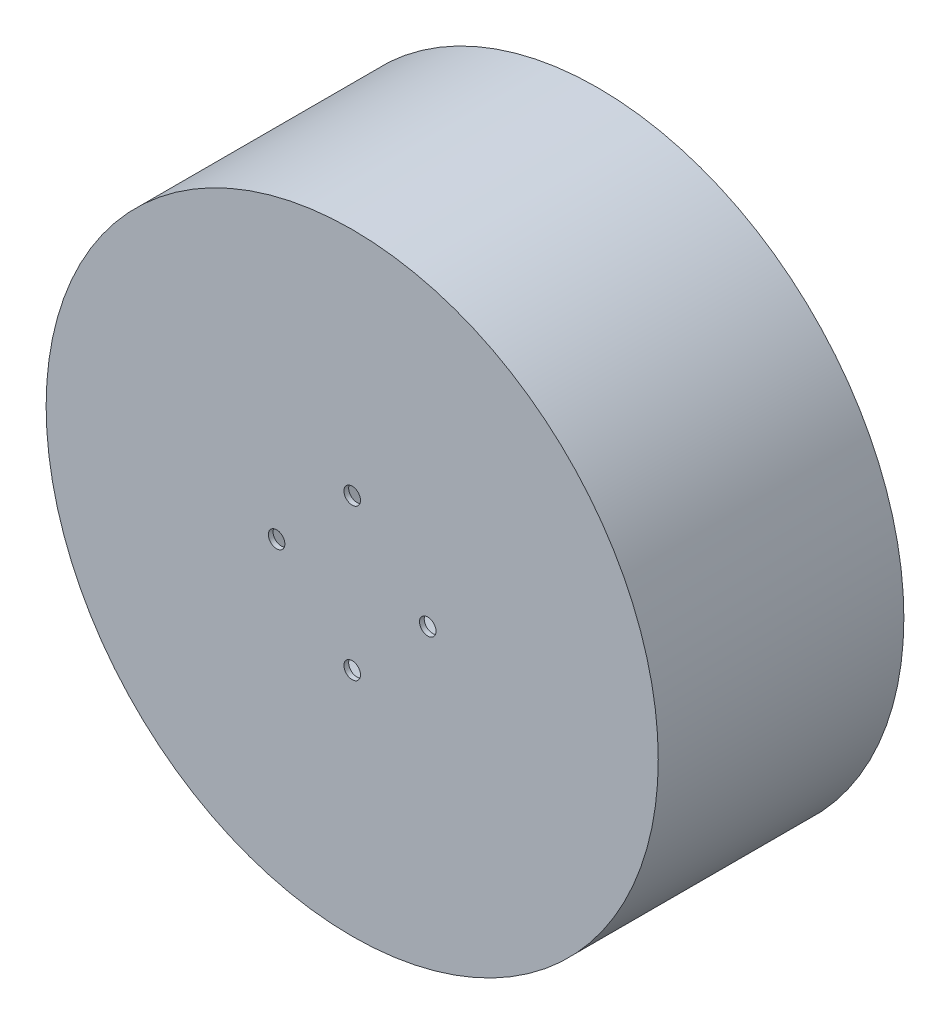
ISO-10303-21;
HEADER;
FILE_DESCRIPTION(('STEP AP214'),'2;1');
FILE_NAME('part.step','',(''),(''),'','','');
FILE_SCHEMA(('AUTOMOTIVE_DESIGN { 1 0 10303 214 1 1 1 1 }'));
ENDSEC;
DATA;
#1=APPLICATION_CONTEXT('core data for automotive mechanical design processes');
#2=APPLICATION_PROTOCOL_DEFINITION('international standard','automotive_design',2000,#1);
#3=PRODUCT_CONTEXT('',#1,'mechanical');
#4=PRODUCT('Part','Part','',(#3));
#5=PRODUCT_RELATED_PRODUCT_CATEGORY('part','',(#4));
#6=PRODUCT_DEFINITION_FORMATION('','',#4);
#7=PRODUCT_DEFINITION_CONTEXT('part definition',#1,'design');
#8=PRODUCT_DEFINITION('design','',#6,#7);
#9=PRODUCT_DEFINITION_SHAPE('','',#8);
#10=(LENGTH_UNIT() NAMED_UNIT(*) SI_UNIT(.MILLI.,.METRE.));
#11=(NAMED_UNIT(*) PLANE_ANGLE_UNIT() SI_UNIT($,.RADIAN.));
#12=(NAMED_UNIT(*) SI_UNIT($,.STERADIAN.) SOLID_ANGLE_UNIT());
#13=UNCERTAINTY_MEASURE_WITH_UNIT(LENGTH_MEASURE(1.E-05),#10,'distance_accuracy_value','');
#14=(GEOMETRIC_REPRESENTATION_CONTEXT(3) GLOBAL_UNCERTAINTY_ASSIGNED_CONTEXT((#13)) GLOBAL_UNIT_ASSIGNED_CONTEXT((#10,
#11,#12)) REPRESENTATION_CONTEXT('',''));
#15=CARTESIAN_POINT('',(0.,0.,0.));
#16=DIRECTION('',(0.,0.,1.));
#17=DIRECTION('',(1.,0.,0.));
#18=AXIS2_PLACEMENT_3D('',#15,#16,#17);
#19=CARTESIAN_POINT('',(0.,0.,3.175));
#20=DIRECTION('',(0.,0.,1.));
#21=DIRECTION('',(1.,0.,0.));
#22=AXIS2_PLACEMENT_3D('',#19,#20,#21);
#23=PLANE('',#22);
#24=CARTESIAN_POINT('',(-3.54734504026462E-13,-50.8,3.175));
#25=DIRECTION('',(0.,0.,1.));
#26=DIRECTION('',(1.,0.,0.));
#27=AXIS2_PLACEMENT_3D('',#24,#25,#26);
#28=CIRCLE('',#27,5.55625);
#29=CARTESIAN_POINT('',(5.55624999999965,-50.8,3.175));
#30=VERTEX_POINT('',#29);
#31=EDGE_CURVE('E53',#30,#30,#28,.T.);
#32=ORIENTED_EDGE('',*,*,#31,.F.);
#33=EDGE_LOOP('',(#32));
#34=FACE_BOUND('',#33,.T.);
#35=CARTESIAN_POINT('',(0.,50.8,3.175));
#36=DIRECTION('',(0.,0.,1.));
#37=DIRECTION('',(1.,0.,0.));
#38=AXIS2_PLACEMENT_3D('',#35,#36,#37);
#39=CIRCLE('',#38,5.55625);
#40=CARTESIAN_POINT('',(5.55625,50.8,3.175));
#41=VERTEX_POINT('',#40);
#42=EDGE_CURVE('E39',#41,#41,#39,.T.);
#43=ORIENTED_EDGE('',*,*,#42,.F.);
#44=EDGE_LOOP('',(#43));
#45=FACE_BOUND('',#44,.T.);
#46=CARTESIAN_POINT('',(50.8,-1.77367252013231E-13,3.175));
#47=DIRECTION('',(0.,0.,1.));
#48=DIRECTION('',(1.,0.,0.));
#49=AXIS2_PLACEMENT_3D('',#46,#47,#48);
#50=CIRCLE('',#49,5.55625);
#51=CARTESIAN_POINT('',(56.35625,-1.77367252013231E-13,3.175));
#52=VERTEX_POINT('',#51);
#53=EDGE_CURVE('E48',#52,#52,#50,.T.);
#54=ORIENTED_EDGE('',*,*,#53,.F.);
#55=EDGE_LOOP('',(#54));
#56=FACE_BOUND('',#55,.T.);
#57=CARTESIAN_POINT('',(-50.8,5.32101756039693E-13,3.175));
#58=DIRECTION('',(0.,0.,1.));
#59=DIRECTION('',(1.,0.,0.));
#60=AXIS2_PLACEMENT_3D('',#57,#58,#59);
#61=CIRCLE('',#60,5.55625);
#62=CARTESIAN_POINT('',(-45.24375,5.32101756039693E-13,3.175));
#63=VERTEX_POINT('',#62);
#64=EDGE_CURVE('E59',#63,#63,#61,.T.);
#65=ORIENTED_EDGE('',*,*,#64,.F.);
#66=EDGE_LOOP('',(#65));
#67=FACE_BOUND('',#66,.T.);
#68=CARTESIAN_POINT('',(0.,0.,3.175));
#69=DIRECTION('',(0.,0.,1.));
#70=DIRECTION('',(1.,0.,0.));
#71=AXIS2_PLACEMENT_3D('',#68,#69,#70);
#72=CIRCLE('',#71,205.74);
#73=CARTESIAN_POINT('',(205.74,0.,3.175));
#74=VERTEX_POINT('',#73);
#75=EDGE_CURVE('E68',#74,#74,#72,.T.);
#76=ORIENTED_EDGE('',*,*,#75,.T.);
#77=EDGE_LOOP('',(#76));
#78=FACE_BOUND('',#77,.T.);
#79=ADVANCED_FACE('F32',(#34,#45,#56,#67,#78),#23,.T.);
#80=CARTESIAN_POINT('',(0.,0.,0.));
#81=DIRECTION('',(0.,0.,1.));
#82=DIRECTION('',(1.,0.,0.));
#83=AXIS2_PLACEMENT_3D('',#80,#81,#82);
#84=PLANE('',#83);
#85=CARTESIAN_POINT('',(0.,0.,0.));
#86=DIRECTION('',(0.,0.,1.));
#87=DIRECTION('',(1.,0.,0.));
#88=AXIS2_PLACEMENT_3D('',#85,#86,#87);
#89=CIRCLE('',#88,101.6);
#90=CARTESIAN_POINT('',(101.6,0.,0.));
#91=VERTEX_POINT('',#90);
#92=EDGE_CURVE('E10',#91,#91,#89,.T.);
#93=ORIENTED_EDGE('',*,*,#92,.F.);
#94=EDGE_LOOP('',(#93));
#95=FACE_BOUND('',#94,.T.);
#96=CARTESIAN_POINT('',(0.,50.8,0.));
#97=DIRECTION('',(0.,0.,1.));
#98=DIRECTION('',(1.,0.,0.));
#99=AXIS2_PLACEMENT_3D('',#96,#97,#98);
#100=CIRCLE('',#99,5.55625);
#101=CARTESIAN_POINT('',(5.55625,50.8,0.));
#102=VERTEX_POINT('',#101);
#103=EDGE_CURVE('E43',#102,#102,#100,.T.);
#104=ORIENTED_EDGE('',*,*,#103,.T.);
#105=EDGE_LOOP('',(#104));
#106=FACE_BOUND('',#105,.T.);
#107=CARTESIAN_POINT('',(50.8,-1.77367252013231E-13,0.));
#108=DIRECTION('',(0.,0.,1.));
#109=DIRECTION('',(1.,0.,0.));
#110=AXIS2_PLACEMENT_3D('',#107,#108,#109);
#111=CIRCLE('',#110,5.55625);
#112=CARTESIAN_POINT('',(56.35625,-1.77367252013231E-13,0.));
#113=VERTEX_POINT('',#112);
#114=EDGE_CURVE('E50',#113,#113,#111,.T.);
#115=ORIENTED_EDGE('',*,*,#114,.T.);
#116=EDGE_LOOP('',(#115));
#117=FACE_BOUND('',#116,.T.);
#118=CARTESIAN_POINT('',(-3.54734504026462E-13,-50.8,0.));
#119=DIRECTION('',(0.,0.,1.));
#120=DIRECTION('',(1.,0.,0.));
#121=AXIS2_PLACEMENT_3D('',#118,#119,#120);
#122=CIRCLE('',#121,5.55625);
#123=CARTESIAN_POINT('',(5.55624999999965,-50.8,0.));
#124=VERTEX_POINT('',#123);
#125=EDGE_CURVE('E56',#124,#124,#122,.T.);
#126=ORIENTED_EDGE('',*,*,#125,.T.);
#127=EDGE_LOOP('',(#126));
#128=FACE_BOUND('',#127,.T.);
#129=CARTESIAN_POINT('',(-50.8,5.32101756039693E-13,0.));
#130=DIRECTION('',(0.,0.,1.));
#131=DIRECTION('',(1.,0.,0.));
#132=AXIS2_PLACEMENT_3D('',#129,#130,#131);
#133=CIRCLE('',#132,5.55625);
#134=CARTESIAN_POINT('',(-45.24375,5.32101756039693E-13,0.));
#135=VERTEX_POINT('',#134);
#136=EDGE_CURVE('E62',#135,#135,#133,.T.);
#137=ORIENTED_EDGE('',*,*,#136,.T.);
#138=EDGE_LOOP('',(#137));
#139=FACE_BOUND('',#138,.T.);
#140=ADVANCED_FACE('F34',(#95,#106,#117,#128,#139),#84,.F.);
#141=CARTESIAN_POINT('',(0.,50.8,3.175));
#142=DIRECTION('',(0.,0.,-1.));
#143=DIRECTION('',(-1.,0.,0.));
#144=AXIS2_PLACEMENT_3D('',#141,#142,#143);
#145=CYLINDRICAL_SURFACE('',#144,5.55625);
#146=ORIENTED_EDGE('',*,*,#42,.T.);
#147=EDGE_LOOP('',(#146));
#148=FACE_BOUND('',#147,.T.);
#149=ORIENTED_EDGE('',*,*,#103,.F.);
#150=EDGE_LOOP('',(#149));
#151=FACE_BOUND('',#150,.T.);
#152=ADVANCED_FACE('F100',(#148,#151),#145,.F.);
#153=CARTESIAN_POINT('',(50.8,-1.77367252013231E-13,3.175));
#154=DIRECTION('',(0.,0.,-1.));
#155=DIRECTION('',(-1.,0.,0.));
#156=AXIS2_PLACEMENT_3D('',#153,#154,#155);
#157=CYLINDRICAL_SURFACE('',#156,5.55625);
#158=ORIENTED_EDGE('',*,*,#53,.T.);
#159=EDGE_LOOP('',(#158));
#160=FACE_BOUND('',#159,.T.);
#161=ORIENTED_EDGE('',*,*,#114,.F.);
#162=EDGE_LOOP('',(#161));
#163=FACE_BOUND('',#162,.T.);
#164=ADVANCED_FACE('F107',(#160,#163),#157,.F.);
#165=CARTESIAN_POINT('',(-3.54734504026462E-13,-50.8,3.175));
#166=DIRECTION('',(0.,0.,-1.));
#167=DIRECTION('',(-1.,0.,0.));
#168=AXIS2_PLACEMENT_3D('',#165,#166,#167);
#169=CYLINDRICAL_SURFACE('',#168,5.55625);
#170=ORIENTED_EDGE('',*,*,#31,.T.);
#171=EDGE_LOOP('',(#170));
#172=FACE_BOUND('',#171,.T.);
#173=ORIENTED_EDGE('',*,*,#125,.F.);
#174=EDGE_LOOP('',(#173));
#175=FACE_BOUND('',#174,.T.);
#176=ADVANCED_FACE('F91',(#172,#175),#169,.F.);
#177=CARTESIAN_POINT('',(-50.8,5.32101756039693E-13,3.175));
#178=DIRECTION('',(0.,0.,-1.));
#179=DIRECTION('',(-1.,0.,0.));
#180=AXIS2_PLACEMENT_3D('',#177,#178,#179);
#181=CYLINDRICAL_SURFACE('',#180,5.55625);
#182=ORIENTED_EDGE('',*,*,#64,.T.);
#183=EDGE_LOOP('',(#182));
#184=FACE_BOUND('',#183,.T.);
#185=ORIENTED_EDGE('',*,*,#136,.F.);
#186=EDGE_LOOP('',(#185));
#187=FACE_BOUND('',#186,.T.);
#188=ADVANCED_FACE('F83',(#184,#187),#181,.F.);
#189=CARTESIAN_POINT('',(0.,0.,-161.925));
#190=DIRECTION('',(0.,0.,1.));
#191=DIRECTION('',(1.,0.,0.));
#192=AXIS2_PLACEMENT_3D('',#189,#190,#191);
#193=CYLINDRICAL_SURFACE('',#192,101.6);
#194=CARTESIAN_POINT('',(0.,0.,-161.925));
#195=DIRECTION('',(0.,0.,1.));
#196=DIRECTION('',(1.,0.,0.));
#197=AXIS2_PLACEMENT_3D('',#194,#195,#196);
#198=CIRCLE('',#197,101.6);
#199=CARTESIAN_POINT('',(101.6,0.,-161.925));
#200=VERTEX_POINT('',#199);
#201=EDGE_CURVE('E71',#200,#200,#198,.T.);
#202=ORIENTED_EDGE('',*,*,#201,.F.);
#203=EDGE_LOOP('',(#202));
#204=FACE_BOUND('',#203,.T.);
#205=ORIENTED_EDGE('',*,*,#92,.T.);
#206=EDGE_LOOP('',(#205));
#207=FACE_BOUND('',#206,.T.);
#208=ADVANCED_FACE('F80',(#204,#207),#193,.F.);
#209=CARTESIAN_POINT('',(0.,0.,-161.925));
#210=DIRECTION('',(0.,0.,1.));
#211=DIRECTION('',(1.,0.,0.));
#212=AXIS2_PLACEMENT_3D('',#209,#210,#211);
#213=CYLINDRICAL_SURFACE('',#212,205.74);
#214=CARTESIAN_POINT('',(0.,0.,-161.925));
#215=DIRECTION('',(0.,0.,1.));
#216=DIRECTION('',(1.,0.,0.));
#217=AXIS2_PLACEMENT_3D('',#214,#215,#216);
#218=CIRCLE('',#217,205.74);
#219=CARTESIAN_POINT('',(205.74,0.,-161.925));
#220=VERTEX_POINT('',#219);
#221=EDGE_CURVE('E65',#220,#220,#218,.T.);
#222=ORIENTED_EDGE('',*,*,#221,.T.);
#223=EDGE_LOOP('',(#222));
#224=FACE_BOUND('',#223,.T.);
#225=ORIENTED_EDGE('',*,*,#75,.F.);
#226=EDGE_LOOP('',(#225));
#227=FACE_BOUND('',#226,.T.);
#228=ADVANCED_FACE('F82',(#224,#227),#213,.T.);
#229=CARTESIAN_POINT('',(0.,0.,-161.925));
#230=DIRECTION('',(0.,0.,1.));
#231=DIRECTION('',(1.,0.,0.));
#232=AXIS2_PLACEMENT_3D('',#229,#230,#231);
#233=PLANE('',#232);
#234=ORIENTED_EDGE('',*,*,#201,.T.);
#235=EDGE_LOOP('',(#234));
#236=FACE_BOUND('',#235,.T.);
#237=ORIENTED_EDGE('',*,*,#221,.F.);
#238=EDGE_LOOP('',(#237));
#239=FACE_BOUND('',#238,.T.);
#240=ADVANCED_FACE('F77',(#236,#239),#233,.F.);
#241=CLOSED_SHELL('',(#79,#140,#152,#164,#176,#188,#208,#228,#240));
#242=MANIFOLD_SOLID_BREP('B2',#241);
#243=ADVANCED_BREP_SHAPE_REPRESENTATION('',(#18,#242),#14);
#244=SHAPE_DEFINITION_REPRESENTATION(#9,#243);
ENDSEC;
END-ISO-10303-21;
